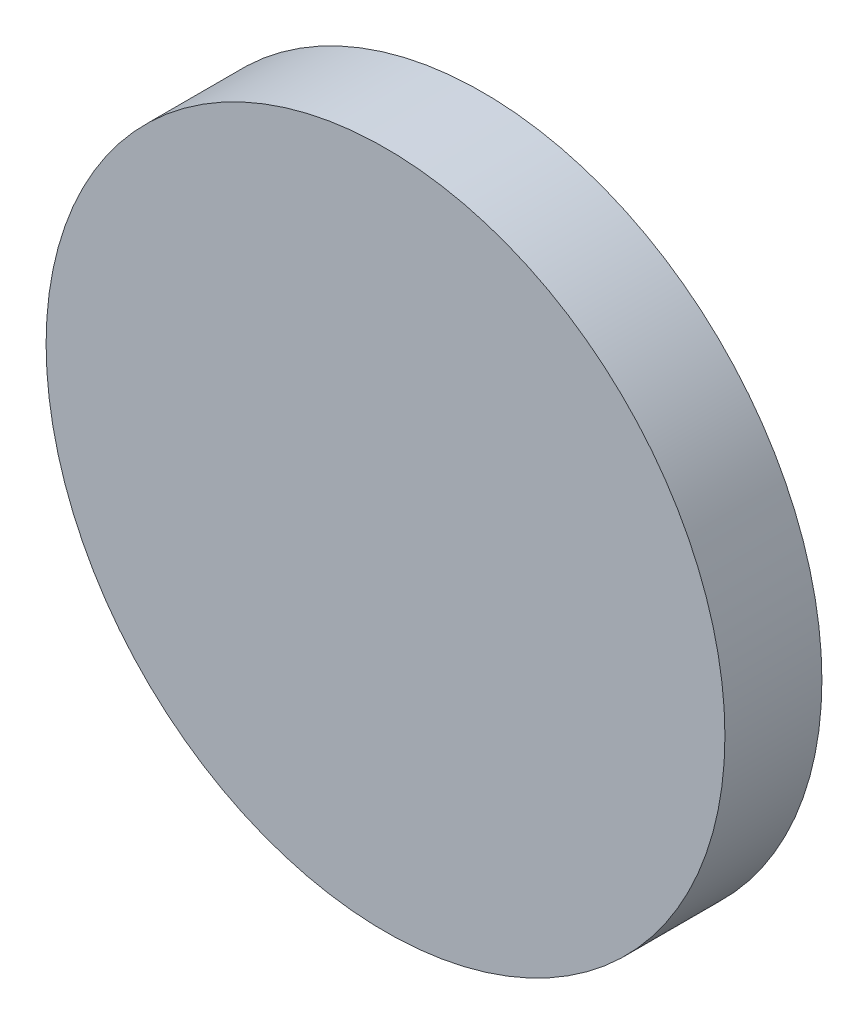
ISO-10303-21;
HEADER;
FILE_DESCRIPTION(('STEP AP214'),'2;1');
FILE_NAME('part.step','',(''),(''),'','','');
FILE_SCHEMA(('AUTOMOTIVE_DESIGN { 1 0 10303 214 1 1 1 1 }'));
ENDSEC;
DATA;
#1=APPLICATION_CONTEXT('core data for automotive mechanical design processes');
#2=APPLICATION_PROTOCOL_DEFINITION('international standard','automotive_design',2000,#1);
#3=PRODUCT_CONTEXT('',#1,'mechanical');
#4=PRODUCT('Part','Part','',(#3));
#5=PRODUCT_RELATED_PRODUCT_CATEGORY('part','',(#4));
#6=PRODUCT_DEFINITION_FORMATION('','',#4);
#7=PRODUCT_DEFINITION_CONTEXT('part definition',#1,'design');
#8=PRODUCT_DEFINITION('design','',#6,#7);
#9=PRODUCT_DEFINITION_SHAPE('','',#8);
#10=(LENGTH_UNIT() NAMED_UNIT(*) SI_UNIT(.MILLI.,.METRE.));
#11=(NAMED_UNIT(*) PLANE_ANGLE_UNIT() SI_UNIT($,.RADIAN.));
#12=(NAMED_UNIT(*) SI_UNIT($,.STERADIAN.) SOLID_ANGLE_UNIT());
#13=UNCERTAINTY_MEASURE_WITH_UNIT(LENGTH_MEASURE(1.E-05),#10,'distance_accuracy_value','');
#14=(GEOMETRIC_REPRESENTATION_CONTEXT(3) GLOBAL_UNCERTAINTY_ASSIGNED_CONTEXT((#13)) GLOBAL_UNIT_ASSIGNED_CONTEXT((#10,
#11,#12)) REPRESENTATION_CONTEXT('',''));
#15=CARTESIAN_POINT('',(0.,0.,0.));
#16=DIRECTION('',(0.,0.,1.));
#17=DIRECTION('',(1.,0.,0.));
#18=AXIS2_PLACEMENT_3D('',#15,#16,#17);
#19=CARTESIAN_POINT('',(0.,0.,6.35));
#20=DIRECTION('',(0.,0.,-1.));
#21=DIRECTION('',(-1.,0.,0.));
#22=AXIS2_PLACEMENT_3D('',#19,#20,#21);
#23=CYLINDRICAL_SURFACE('',#22,22.225);
#24=CARTESIAN_POINT('',(0.,0.,6.35));
#25=DIRECTION('',(0.,0.,1.));
#26=DIRECTION('',(1.,0.,0.));
#27=AXIS2_PLACEMENT_3D('',#24,#25,#26);
#28=CIRCLE('',#27,22.225);
#29=CARTESIAN_POINT('',(22.225,0.,6.35));
#30=VERTEX_POINT('',#29);
#31=EDGE_CURVE('E10',#30,#30,#28,.T.);
#32=ORIENTED_EDGE('',*,*,#31,.F.);
#33=EDGE_LOOP('',(#32));
#34=FACE_BOUND('',#33,.T.);
#35=CARTESIAN_POINT('',(0.,0.,0.));
#36=DIRECTION('',(0.,0.,1.));
#37=DIRECTION('',(1.,0.,0.));
#38=AXIS2_PLACEMENT_3D('',#35,#36,#37);
#39=CIRCLE('',#38,22.225);
#40=CARTESIAN_POINT('',(22.225,0.,0.));
#41=VERTEX_POINT('',#40);
#42=EDGE_CURVE('E33',#41,#41,#39,.T.);
#43=ORIENTED_EDGE('',*,*,#42,.T.);
#44=EDGE_LOOP('',(#43));
#45=FACE_BOUND('',#44,.T.);
#46=ADVANCED_FACE('F30',(#34,#45),#23,.T.);
#47=CARTESIAN_POINT('',(0.,0.,6.35));
#48=DIRECTION('',(0.,0.,1.));
#49=DIRECTION('',(1.,0.,0.));
#50=AXIS2_PLACEMENT_3D('',#47,#48,#49);
#51=PLANE('',#50);
#52=ORIENTED_EDGE('',*,*,#31,.T.);
#53=EDGE_LOOP('',(#52));
#54=FACE_BOUND('',#53,.T.);
#55=ADVANCED_FACE('F45',(#54),#51,.T.);
#56=CARTESIAN_POINT('',(0.,0.,0.));
#57=DIRECTION('',(0.,0.,1.));
#58=DIRECTION('',(1.,0.,0.));
#59=AXIS2_PLACEMENT_3D('',#56,#57,#58);
#60=PLANE('',#59);
#61=ORIENTED_EDGE('',*,*,#42,.F.);
#62=EDGE_LOOP('',(#61));
#63=FACE_BOUND('',#62,.T.);
#64=ADVANCED_FACE('F43',(#63),#60,.F.);
#65=CLOSED_SHELL('',(#46,#55,#64));
#66=MANIFOLD_SOLID_BREP('B2',#65);
#67=ADVANCED_BREP_SHAPE_REPRESENTATION('',(#18,#66),#14);
#68=SHAPE_DEFINITION_REPRESENTATION(#9,#67);
ENDSEC;
END-ISO-10303-21;
